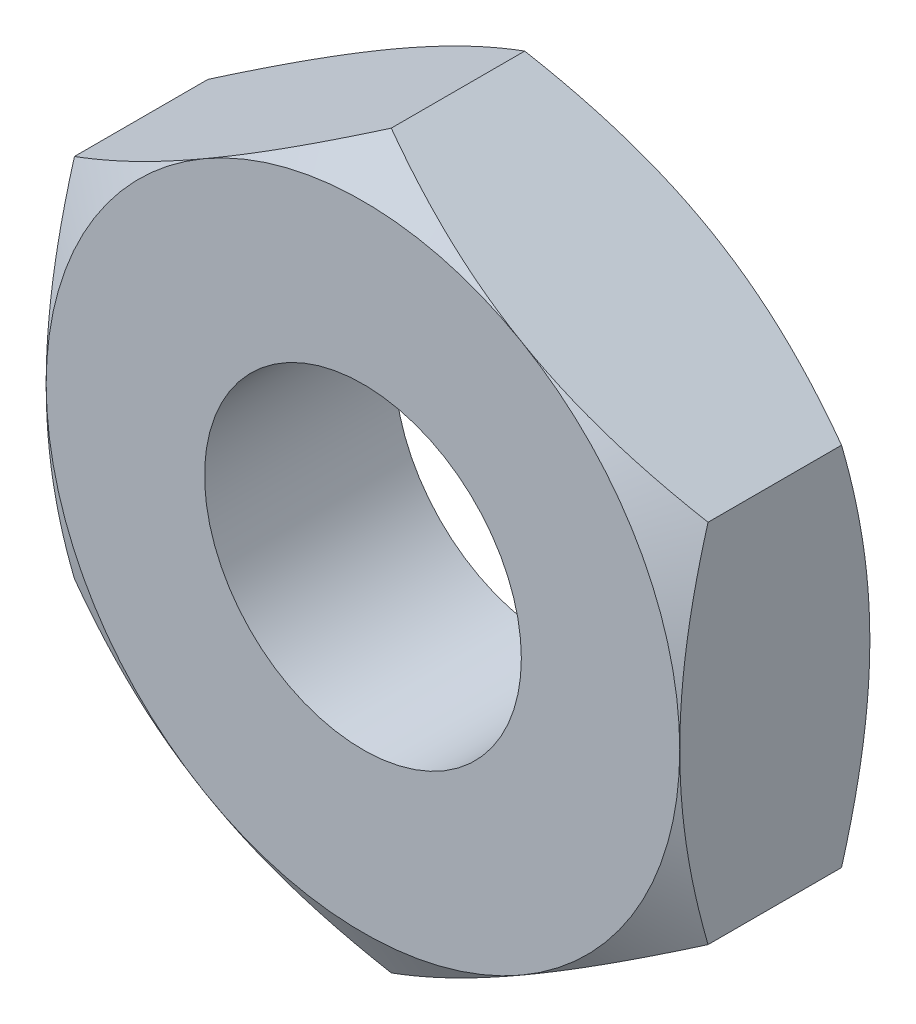
ISO-10303-21;
HEADER;
FILE_DESCRIPTION(('STEP AP214'),'2;1');
FILE_NAME('part.step','',(''),(''),'','','');
FILE_SCHEMA(('AUTOMOTIVE_DESIGN { 1 0 10303 214 1 1 1 1 }'));
ENDSEC;
DATA;
#1=APPLICATION_CONTEXT('core data for automotive mechanical design processes');
#2=APPLICATION_PROTOCOL_DEFINITION('international standard','automotive_design',2000,#1);
#3=PRODUCT_CONTEXT('',#1,'mechanical');
#4=PRODUCT('Part','Part','',(#3));
#5=PRODUCT_RELATED_PRODUCT_CATEGORY('part','',(#4));
#6=PRODUCT_DEFINITION_FORMATION('','',#4);
#7=PRODUCT_DEFINITION_CONTEXT('part definition',#1,'design');
#8=PRODUCT_DEFINITION('design','',#6,#7);
#9=PRODUCT_DEFINITION_SHAPE('','',#8);
#10=(LENGTH_UNIT() NAMED_UNIT(*) SI_UNIT(.MILLI.,.METRE.));
#11=(NAMED_UNIT(*) PLANE_ANGLE_UNIT() SI_UNIT($,.RADIAN.));
#12=(NAMED_UNIT(*) SI_UNIT($,.STERADIAN.) SOLID_ANGLE_UNIT());
#13=UNCERTAINTY_MEASURE_WITH_UNIT(LENGTH_MEASURE(1.E-05),#10,'distance_accuracy_value','');
#14=(GEOMETRIC_REPRESENTATION_CONTEXT(3) GLOBAL_UNCERTAINTY_ASSIGNED_CONTEXT((#13)) GLOBAL_UNIT_ASSIGNED_CONTEXT((#10,
#11,#12)) REPRESENTATION_CONTEXT('',''));
#15=CARTESIAN_POINT('',(0.,0.,0.));
#16=DIRECTION('',(0.,0.,1.));
#17=DIRECTION('',(1.,0.,0.));
#18=AXIS2_PLACEMENT_3D('',#15,#16,#17);
#19=CARTESIAN_POINT('',(0.,0.,-0.6));
#20=DIRECTION('',(0.,0.,1.));
#21=DIRECTION('',(1.,0.,0.));
#22=AXIS2_PLACEMENT_3D('',#19,#20,#21);
#23=PLANE('',#22);
#24=CARTESIAN_POINT('',(0.,0.,-0.6));
#25=DIRECTION('',(0.,0.,1.));
#26=DIRECTION('',(1.,0.,0.));
#27=AXIS2_PLACEMENT_3D('',#24,#25,#26);
#28=CIRCLE('',#27,1.);
#29=CARTESIAN_POINT('',(1.,0.,-0.6));
#30=VERTEX_POINT('',#29);
#31=EDGE_CURVE('E250',#30,#30,#28,.T.);
#32=ORIENTED_EDGE('',*,*,#31,.T.);
#33=EDGE_LOOP('',(#32));
#34=FACE_BOUND('',#33,.T.);
#35=CARTESIAN_POINT('',(0.,0.,-0.6));
#36=DIRECTION('',(0.,0.,1.));
#37=DIRECTION('',(1.,0.,0.));
#38=AXIS2_PLACEMENT_3D('',#35,#36,#37);
#39=CIRCLE('',#38,2.);
#40=CARTESIAN_POINT('',(2.,0.,-0.6));
#41=VERTEX_POINT('',#40);
#42=CARTESIAN_POINT('',(0.999999999999994,1.73205080756888,-0.6));
#43=VERTEX_POINT('',#42);
#44=EDGE_CURVE('E131',#41,#43,#39,.T.);
#45=ORIENTED_EDGE('',*,*,#44,.F.);
#46=CARTESIAN_POINT('',(0.,0.,-0.6));
#47=DIRECTION('',(0.,0.,1.));
#48=DIRECTION('',(1.,0.,0.));
#49=AXIS2_PLACEMENT_3D('',#46,#47,#48);
#50=CIRCLE('',#49,2.);
#51=CARTESIAN_POINT('',(1.00000000000001,-1.73205080756887,-0.6));
#52=VERTEX_POINT('',#51);
#53=EDGE_CURVE('E12',#41,#52,#50,.F.);
#54=ORIENTED_EDGE('',*,*,#53,.T.);
#55=CARTESIAN_POINT('',(-0.999999999999995,-1.73205080756888,-0.6));
#56=VERTEX_POINT('',#55);
#57=EDGE_CURVE('E43',#52,#56,#50,.F.);
#58=ORIENTED_EDGE('',*,*,#57,.T.);
#59=CARTESIAN_POINT('',(-2.,0.,-0.6));
#60=VERTEX_POINT('',#59);
#61=EDGE_CURVE('E309',#56,#60,#50,.F.);
#62=ORIENTED_EDGE('',*,*,#61,.T.);
#63=CARTESIAN_POINT('',(-1.,1.73205080756888,-0.6));
#64=VERTEX_POINT('',#63);
#65=EDGE_CURVE('E143',#60,#64,#50,.F.);
#66=ORIENTED_EDGE('',*,*,#65,.T.);
#67=EDGE_CURVE('E44',#64,#43,#50,.F.);
#68=ORIENTED_EDGE('',*,*,#67,.T.);
#69=EDGE_LOOP('',(#45,#54,#58,#62,#66,#68));
#70=FACE_BOUND('',#69,.T.);
#71=ADVANCED_FACE('F34',(#34,#70),#23,.F.);
#72=CARTESIAN_POINT('',(0.,0.,0.6));
#73=DIRECTION('',(0.,0.,1.));
#74=DIRECTION('',(1.,0.,0.));
#75=AXIS2_PLACEMENT_3D('',#72,#73,#74);
#76=PLANE('',#75);
#77=CARTESIAN_POINT('',(0.,0.,0.6));
#78=DIRECTION('',(0.,0.,1.));
#79=DIRECTION('',(1.,0.,0.));
#80=AXIS2_PLACEMENT_3D('',#77,#78,#79);
#81=CIRCLE('',#80,1.);
#82=CARTESIAN_POINT('',(1.,0.,0.6));
#83=VERTEX_POINT('',#82);
#84=EDGE_CURVE('E246',#83,#83,#81,.T.);
#85=ORIENTED_EDGE('',*,*,#84,.F.);
#86=EDGE_LOOP('',(#85));
#87=FACE_BOUND('',#86,.T.);
#88=CARTESIAN_POINT('',(0.,0.,0.6));
#89=DIRECTION('',(0.,0.,1.));
#90=DIRECTION('',(1.,0.,0.));
#91=AXIS2_PLACEMENT_3D('',#88,#89,#90);
#92=CIRCLE('',#91,2.);
#93=CARTESIAN_POINT('',(1.00000000000001,-1.73205080756887,0.6));
#94=VERTEX_POINT('',#93);
#95=CARTESIAN_POINT('',(2.,0.,0.6));
#96=VERTEX_POINT('',#95);
#97=EDGE_CURVE('E291',#94,#96,#92,.T.);
#98=ORIENTED_EDGE('',*,*,#97,.T.);
#99=CARTESIAN_POINT('',(0.999999999999997,1.73205080756889,0.6));
#100=VERTEX_POINT('',#99);
#101=EDGE_CURVE('E280',#96,#100,#92,.T.);
#102=ORIENTED_EDGE('',*,*,#101,.T.);
#103=CARTESIAN_POINT('',(-1.,1.73205080756888,0.6));
#104=VERTEX_POINT('',#103);
#105=EDGE_CURVE('E284',#100,#104,#92,.T.);
#106=ORIENTED_EDGE('',*,*,#105,.T.);
#107=CARTESIAN_POINT('',(-2.,0.,0.6));
#108=VERTEX_POINT('',#107);
#109=EDGE_CURVE('E288',#104,#108,#92,.T.);
#110=ORIENTED_EDGE('',*,*,#109,.T.);
#111=CARTESIAN_POINT('',(-0.999999999999995,-1.73205080756888,0.6));
#112=VERTEX_POINT('',#111);
#113=EDGE_CURVE('E294',#108,#112,#92,.T.);
#114=ORIENTED_EDGE('',*,*,#113,.T.);
#115=EDGE_CURVE('E293',#112,#94,#92,.T.);
#116=ORIENTED_EDGE('',*,*,#115,.T.);
#117=EDGE_LOOP('',(#98,#102,#106,#110,#114,#116));
#118=FACE_BOUND('',#117,.T.);
#119=ADVANCED_FACE('F289',(#87,#118),#76,.T.);
#120=CARTESIAN_POINT('',(0.,2.3094010767585,0.6));
#121=DIRECTION('',(0.500000000000002,-0.866025403784438,0.));
#122=DIRECTION('',(0.866025403784438,0.500000000000002,0.));
#123=AXIS2_PLACEMENT_3D('',#120,#121,#122);
#124=PLANE('',#123);
#125=DIRECTION('',(0.,0.,-1.));
#126=VECTOR('',#125,1.);
#127=CARTESIAN_POINT('',(0.,2.3094010767585,0.6));
#128=LINE('',#127,#126);
#129=CARTESIAN_POINT('',(0.,2.3094010767585,0.421367205045918));
#130=VERTEX_POINT('',#129);
#131=CARTESIAN_POINT('',(0.,2.3094010767585,-0.421367205045918));
#132=VERTEX_POINT('',#131);
#133=EDGE_CURVE('E249',#130,#132,#128,.T.);
#134=ORIENTED_EDGE('',*,*,#133,.T.);
#135=CARTESIAN_POINT('',(0.000200000000000053,2.30951654681234,-0.421300533379501));
#136=CARTESIAN_POINT('',(-0.08769126290006,2.25877250251758,-0.45061046389932));
#137=CARTESIAN_POINT('',(-0.176341194473591,2.20759044065996,-0.477267148019532));
#138=CARTESIAN_POINT('',(-0.355176246997802,2.10433997494456,-0.523797508979278));
#139=CARTESIAN_POINT('',(-0.445364546505036,2.05226973594631,-0.54365472361722));
#140=CARTESIAN_POINT('',(-0.624623385763306,1.94877459684592,-0.574566535976747));
#141=CARTESIAN_POINT('',(-0.713666338226304,1.89736562427197,-0.585826848401469));
#142=CARTESIAN_POINT('',(-0.892171397785042,1.79430568008402,-0.599271337405358));
#143=CARTESIAN_POINT('',(-0.981632855703957,1.74265508327244,-0.601466645046532));
#144=CARTESIAN_POINT('',(-1.1488083535488,1.64613626458981,-0.596909010669351));
#145=CARTESIAN_POINT('',(-1.22654737026578,1.60125362236172,-0.591275125312986));
#146=CARTESIAN_POINT('',(-1.38151891453613,1.51178075956051,-0.573416104739172));
#147=CARTESIAN_POINT('',(-1.4587509057412,1.46719084864821,-0.561184863976561));
#148=CARTESIAN_POINT('',(-1.6140421864822,1.37753338590959,-0.53060656313239));
#149=CARTESIAN_POINT('',(-1.69208181310738,1.33247718647008,-0.512129832934284));
#150=CARTESIAN_POINT('',(-1.84699686569214,1.24303693915875,-0.470194481787144));
#151=CARTESIAN_POINT('',(-1.92387427762312,1.19865174468579,-0.446745719507687));
#152=CARTESIAN_POINT('',(-2.0002,1.15458506832541,-0.421300533379502));
#153=B_SPLINE_CURVE_WITH_KNOTS('',3,(#135,#136,#137,#138,#139,#140,#141,#142,#143,#144,#145,
#146,#147,#148,#149,#150,#151,#152),.UNSPECIFIED.,.F.,.F.,(4,2,2,2,2,2,2,2,4),(0.,
0.31703182469561,0.634825876346564,0.944753967652636,1.25430138000371,1.52387047293094,
1.79368946861029,2.06949491027634,2.34475850821473),.UNSPECIFIED.);
#154=EDGE_CURVE('E57',#132,#64,#153,.T.);
#155=ORIENTED_EDGE('',*,*,#154,.T.);
#156=CARTESIAN_POINT('',(-2.,1.15470053837925,-0.421367205045919));
#157=VERTEX_POINT('',#156);
#158=EDGE_CURVE('E176',#64,#157,#153,.T.);
#159=ORIENTED_EDGE('',*,*,#158,.T.);
#160=DIRECTION('',(0.,0.,-1.));
#161=VECTOR('',#160,1.);
#162=CARTESIAN_POINT('',(-2.,1.15470053837925,0.6));
#163=LINE('',#162,#161);
#164=CARTESIAN_POINT('',(-2.,1.15470053837925,0.421367205045919));
#165=VERTEX_POINT('',#164);
#166=EDGE_CURVE('E264',#165,#157,#163,.T.);
#167=ORIENTED_EDGE('',*,*,#166,.F.);
#168=CARTESIAN_POINT('',(0.000200000000000053,2.30951654681234,0.421300533379501));
#169=CARTESIAN_POINT('',(-0.08769126290006,2.25877250251758,0.45061046389932));
#170=CARTESIAN_POINT('',(-0.176341194473591,2.20759044065996,0.477267148019532));
#171=CARTESIAN_POINT('',(-0.355176246997802,2.10433997494456,0.523797508979278));
#172=CARTESIAN_POINT('',(-0.445364546505036,2.05226973594631,0.54365472361722));
#173=CARTESIAN_POINT('',(-0.624623385763306,1.94877459684592,0.574566535976747));
#174=CARTESIAN_POINT('',(-0.713666338226304,1.89736562427197,0.585826848401469));
#175=CARTESIAN_POINT('',(-0.892171397785042,1.79430568008402,0.599271337405358));
#176=CARTESIAN_POINT('',(-0.981632855703957,1.74265508327244,0.601466645046532));
#177=CARTESIAN_POINT('',(-1.1488083535488,1.64613626458981,0.596909010669351));
#178=CARTESIAN_POINT('',(-1.22654737026578,1.60125362236172,0.591275125312986));
#179=CARTESIAN_POINT('',(-1.38151891453613,1.51178075956051,0.573416104739172));
#180=CARTESIAN_POINT('',(-1.4587509057412,1.46719084864821,0.561184863976561));
#181=CARTESIAN_POINT('',(-1.6140421864822,1.37753338590959,0.53060656313239));
#182=CARTESIAN_POINT('',(-1.69208181310738,1.33247718647008,0.512129832934284));
#183=CARTESIAN_POINT('',(-1.84699686569214,1.24303693915875,0.470194481787144));
#184=CARTESIAN_POINT('',(-1.92387427762312,1.19865174468579,0.446745719507687));
#185=CARTESIAN_POINT('',(-2.0002,1.15458506832541,0.421300533379502));
#186=B_SPLINE_CURVE_WITH_KNOTS('',3,(#168,#169,#170,#171,#172,#173,#174,#175,#176,#177,#178,
#179,#180,#181,#182,#183,#184,#185),.UNSPECIFIED.,.F.,.F.,(4,2,2,2,2,2,2,2,4),(0.,
0.31703182469561,0.634825876346564,0.944753967652636,1.25430138000371,1.52387047293094,
1.79368946861029,2.06949491027634,2.34475850821473),.UNSPECIFIED.);
#187=EDGE_CURVE('E239',#104,#165,#186,.T.);
#188=ORIENTED_EDGE('',*,*,#187,.F.);
#189=EDGE_CURVE('E245',#130,#104,#186,.T.);
#190=ORIENTED_EDGE('',*,*,#189,.F.);
#191=EDGE_LOOP('',(#134,#155,#159,#167,#188,#190));
#192=FACE_BOUND('',#191,.T.);
#193=ADVANCED_FACE('F36',(#192),#124,.F.);
#194=CARTESIAN_POINT('',(-2.,1.15470053837925,0.6));
#195=DIRECTION('',(1.,0.,0.));
#196=DIRECTION('',(0.,1.,0.));
#197=AXIS2_PLACEMENT_3D('',#194,#195,#196);
#198=PLANE('',#197);
#199=ORIENTED_EDGE('',*,*,#166,.T.);
#200=CARTESIAN_POINT('',(-2.00000000000001,3.75746337783833,0.702840986247626));
#201=CARTESIAN_POINT('',(-2.00000000000001,3.66917172951027,0.657849443135192));
#202=CARTESIAN_POINT('',(-2.00000000000001,3.58074237089131,0.61312562510321));
#203=CARTESIAN_POINT('',(-2.00000000000001,3.40354641738006,0.524346435933649));
#204=CARTESIAN_POINT('',(-2.00000000000001,3.31477981481889,0.480291080111966));
#205=CARTESIAN_POINT('',(-2.00000000000001,3.13669482039065,0.392906957020903));
#206=CARTESIAN_POINT('',(-2.00000000000001,3.04737573181409,0.349579606944415));
#207=CARTESIAN_POINT('',(-2.00000000000001,2.86826224878121,0.263913636120215));
#208=CARTESIAN_POINT('',(-2.00000000000001,2.77846784732515,0.221575029983321));
#209=CARTESIAN_POINT('',(-2.00000000000001,2.59380818983547,0.136035760364889));
#210=CARTESIAN_POINT('',(-2.00000000000001,2.49891380906719,0.0928977818514236));
#211=CARTESIAN_POINT('',(-2.00000000000001,2.30836710346166,0.00833126977036773));
#212=CARTESIAN_POINT('',(-2.00000000000001,2.21271480125747,-0.0330973146155662));
#213=CARTESIAN_POINT('',(-2.00000000000001,2.02055466391046,-0.113736768129769));
#214=CARTESIAN_POINT('',(-2.00000000000001,1.92404748617733,-0.152949194790178));
#215=CARTESIAN_POINT('',(-2.00000000000001,1.7298992750654,-0.228549126978886));
#216=CARTESIAN_POINT('',(-2.00000000000001,1.63225796403676,-0.264935923255911));
#217=CARTESIAN_POINT('',(-2.,1.4171681199187,-0.340515018572487));
#218=CARTESIAN_POINT('',(-2.,1.29944840226887,-0.378947707550387));
#219=CARTESIAN_POINT('',(-2.,1.06193288533875,-0.448655367473114));
#220=CARTESIAN_POINT('',(-2.,0.942138243099315,-0.479934197642316));
#221=CARTESIAN_POINT('',(-2.,0.702605318604806,-0.532456937150817));
#222=CARTESIAN_POINT('',(-2.,0.58290617665427,-0.553874120760022));
#223=CARTESIAN_POINT('',(-2.,0.342017147900515,-0.585190615726701));
#224=CARTESIAN_POINT('',(-2.,0.220828109926115,-0.595096203771341));
#225=CARTESIAN_POINT('',(-2.,-0.0232282060015865,-0.602087718763101));
#226=CARTESIAN_POINT('',(-2.,-0.146099624841999,-0.59903618356641));
#227=CARTESIAN_POINT('',(-2.,-0.390875350621727,-0.580247436672821));
#228=CARTESIAN_POINT('',(-2.,-0.512779232204752,-0.564504927224491));
#229=CARTESIAN_POINT('',(-2.,-0.756985470946914,-0.521929945841561));
#230=CARTESIAN_POINT('',(-2.,-0.87925031587679,-0.49488980160422));
#231=CARTESIAN_POINT('',(-2.,-1.12155171452338,-0.432315261828746));
#232=CARTESIAN_POINT('',(-2.,-1.24158783698637,-0.396779240438377));
#233=CARTESIAN_POINT('',(-2.,-1.46730599994426,-0.323476159369775));
#234=CARTESIAN_POINT('',(-2.,-1.57318984746894,-0.286318837832401));
#235=CARTESIAN_POINT('',(-1.99999999999999,-1.78356953450497,-0.208239316128));
#236=CARTESIAN_POINT('',(-1.99999999999999,-1.88806512681808,-0.167316455470022));
#237=CARTESIAN_POINT('',(-1.99999999999999,-2.09597854894717,-0.0826059301377737));
#238=CARTESIAN_POINT('',(-1.99999999999999,-2.19939543852549,-0.0388159747607385));
#239=CARTESIAN_POINT('',(-1.99999999999999,-2.4052882083347,0.0509255344358591));
#240=CARTESIAN_POINT('',(-1.99999999999999,-2.50776404575429,0.0968771860209141));
#241=CARTESIAN_POINT('',(-1.99999999999999,-2.70670372287223,0.188044843586186));
#242=CARTESIAN_POINT('',(-1.99999999999999,-2.8032059635241,0.233177366355573));
#243=CARTESIAN_POINT('',(-1.99999999999999,-2.99564549642073,0.324635109776746));
#244=CARTESIAN_POINT('',(-1.99999999999999,-3.09158277400964,0.370960361203404));
#245=CARTESIAN_POINT('',(-1.99999999999999,-3.28273456532147,0.464440880452887));
#246=CARTESIAN_POINT('',(-1.99999999999999,-3.3779503234191,0.511593609421466));
#247=CARTESIAN_POINT('',(-1.99999999999999,-3.56798434011714,0.60667601457916));
#248=CARTESIAN_POINT('',(-1.99999999999999,-3.66280262841558,0.654605631370073));
#249=CARTESIAN_POINT('',(-1.99999999999999,-3.75746337783835,0.702840986247627));
#250=B_SPLINE_CURVE_WITH_KNOTS('',3,(#200,#201,#202,#203,#204,#205,#206,#207,#208,#209,#210,
#211,#212,#213,#214,#215,#216,#217,#218,#219,#220,#221,#222,#223,#224,#225,#226,#227,#228,#229,
#230,#231,#232,#233,#234,#235,#236,#237,#238,#239,#240,#241,#242,#243,#244,#245,#246,#247,#248,
#249),.UNSPECIFIED.,.F.,.F.,(4,2,2,2,2,2,2,2,2,2,2,2,2,2,2,2,2,2,2,2,2,2,2,2,4),(0.,
0.29728375049296,0.594574302137346,0.892388736257846,1.19020756844579,1.5029121581207,
1.81560744473584,2.12808016171273,2.44063105950698,2.8119699579421,3.18310805870476,
3.54744973205117,3.91159265508218,4.27960836927934,4.6477777884582,5.02303531559516,
5.39836471316207,5.73491980378193,6.0715340404828,6.40842058120788,6.74532237273558,
7.06491645637614,7.38451879448682,7.70327003101737,8.02199701080364),.UNSPECIFIED.);
#251=EDGE_CURVE('E297',#157,#60,#250,.T.);
#252=ORIENTED_EDGE('',*,*,#251,.T.);
#253=CARTESIAN_POINT('',(-2.,-1.15470053837926,-0.421367205045919));
#254=VERTEX_POINT('',#253);
#255=EDGE_CURVE('E202',#60,#254,#250,.T.);
#256=ORIENTED_EDGE('',*,*,#255,.T.);
#257=DIRECTION('',(0.,0.,-1.));
#258=VECTOR('',#257,1.);
#259=CARTESIAN_POINT('',(-2.,-1.15470053837926,0.6));
#260=LINE('',#259,#258);
#261=CARTESIAN_POINT('',(-2.,-1.15470053837926,0.421367205045919));
#262=VERTEX_POINT('',#261);
#263=EDGE_CURVE('E261',#262,#254,#260,.T.);
#264=ORIENTED_EDGE('',*,*,#263,.F.);
#265=CARTESIAN_POINT('',(-2.00000000000001,3.75746337783833,-0.702840986247626));
#266=CARTESIAN_POINT('',(-2.00000000000001,3.66917172951027,-0.657849443135192));
#267=CARTESIAN_POINT('',(-2.00000000000001,3.58074237089131,-0.61312562510321));
#268=CARTESIAN_POINT('',(-2.00000000000001,3.40354641738006,-0.524346435933649));
#269=CARTESIAN_POINT('',(-2.00000000000001,3.31477981481889,-0.480291080111966));
#270=CARTESIAN_POINT('',(-2.00000000000001,3.13669482039065,-0.392906957020903));
#271=CARTESIAN_POINT('',(-2.00000000000001,3.04737573181409,-0.349579606944415));
#272=CARTESIAN_POINT('',(-2.00000000000001,2.86826224878121,-0.263913636120215));
#273=CARTESIAN_POINT('',(-2.00000000000001,2.77846784732515,-0.221575029983321));
#274=CARTESIAN_POINT('',(-2.00000000000001,2.59380818983547,-0.136035760364889));
#275=CARTESIAN_POINT('',(-2.00000000000001,2.49891380906719,-0.0928977818514236));
#276=CARTESIAN_POINT('',(-2.00000000000001,2.30836710346166,-0.00833126977036773));
#277=CARTESIAN_POINT('',(-2.00000000000001,2.21271480125747,0.0330973146155662));
#278=CARTESIAN_POINT('',(-2.00000000000001,2.02055466391046,0.113736768129769));
#279=CARTESIAN_POINT('',(-2.00000000000001,1.92404748617733,0.152949194790178));
#280=CARTESIAN_POINT('',(-2.00000000000001,1.7298992750654,0.228549126978886));
#281=CARTESIAN_POINT('',(-2.00000000000001,1.63225796403676,0.264935923255911));
#282=CARTESIAN_POINT('',(-2.,1.4171681199187,0.340515018572487));
#283=CARTESIAN_POINT('',(-2.,1.29944840226887,0.378947707550387));
#284=CARTESIAN_POINT('',(-2.,1.06193288533875,0.448655367473114));
#285=CARTESIAN_POINT('',(-2.,0.942138243099315,0.479934197642316));
#286=CARTESIAN_POINT('',(-2.,0.702605318604806,0.532456937150817));
#287=CARTESIAN_POINT('',(-2.,0.58290617665427,0.553874120760022));
#288=CARTESIAN_POINT('',(-2.,0.342017147900515,0.585190615726701));
#289=CARTESIAN_POINT('',(-2.,0.220828109926115,0.595096203771341));
#290=CARTESIAN_POINT('',(-2.,-0.0232282060015865,0.602087718763101));
#291=CARTESIAN_POINT('',(-2.,-0.146099624841999,0.59903618356641));
#292=CARTESIAN_POINT('',(-2.,-0.390875350621727,0.580247436672821));
#293=CARTESIAN_POINT('',(-2.,-0.512779232204752,0.564504927224491));
#294=CARTESIAN_POINT('',(-2.,-0.756985470946914,0.521929945841561));
#295=CARTESIAN_POINT('',(-2.,-0.87925031587679,0.49488980160422));
#296=CARTESIAN_POINT('',(-2.,-1.12155171452338,0.432315261828746));
#297=CARTESIAN_POINT('',(-2.,-1.24158783698637,0.396779240438377));
#298=CARTESIAN_POINT('',(-2.,-1.46730599994426,0.323476159369775));
#299=CARTESIAN_POINT('',(-2.,-1.57318984746894,0.286318837832401));
#300=CARTESIAN_POINT('',(-1.99999999999999,-1.78356953450497,0.208239316128));
#301=CARTESIAN_POINT('',(-1.99999999999999,-1.88806512681808,0.167316455470022));
#302=CARTESIAN_POINT('',(-1.99999999999999,-2.09597854894717,0.0826059301377737));
#303=CARTESIAN_POINT('',(-1.99999999999999,-2.19939543852549,0.0388159747607385));
#304=CARTESIAN_POINT('',(-1.99999999999999,-2.4052882083347,-0.0509255344358591));
#305=CARTESIAN_POINT('',(-1.99999999999999,-2.50776404575429,-0.0968771860209141));
#306=CARTESIAN_POINT('',(-1.99999999999999,-2.70670372287223,-0.188044843586186));
#307=CARTESIAN_POINT('',(-1.99999999999999,-2.8032059635241,-0.233177366355573));
#308=CARTESIAN_POINT('',(-1.99999999999999,-2.99564549642073,-0.324635109776746));
#309=CARTESIAN_POINT('',(-1.99999999999999,-3.09158277400964,-0.370960361203404));
#310=CARTESIAN_POINT('',(-1.99999999999999,-3.28273456532147,-0.464440880452887));
#311=CARTESIAN_POINT('',(-1.99999999999999,-3.3779503234191,-0.511593609421466));
#312=CARTESIAN_POINT('',(-1.99999999999999,-3.56798434011714,-0.60667601457916));
#313=CARTESIAN_POINT('',(-1.99999999999999,-3.66280262841558,-0.654605631370073));
#314=CARTESIAN_POINT('',(-1.99999999999999,-3.75746337783835,-0.702840986247627));
#315=B_SPLINE_CURVE_WITH_KNOTS('',3,(#265,#266,#267,#268,#269,#270,#271,#272,#273,#274,#275,
#276,#277,#278,#279,#280,#281,#282,#283,#284,#285,#286,#287,#288,#289,#290,#291,#292,#293,#294,
#295,#296,#297,#298,#299,#300,#301,#302,#303,#304,#305,#306,#307,#308,#309,#310,#311,#312,#313,
#314),.UNSPECIFIED.,.F.,.F.,(4,2,2,2,2,2,2,2,2,2,2,2,2,2,2,2,2,2,2,2,2,2,2,2,4),(0.,
0.29728375049296,0.594574302137346,0.892388736257846,1.19020756844579,1.5029121581207,
1.81560744473584,2.12808016171273,2.44063105950698,2.8119699579421,3.18310805870476,
3.54744973205117,3.91159265508218,4.27960836927934,4.6477777884582,5.02303531559516,
5.39836471316207,5.73491980378193,6.0715340404828,6.40842058120788,6.74532237273558,
7.06491645637614,7.38451879448682,7.70327003101737,8.02199701080364),.UNSPECIFIED.);
#316=EDGE_CURVE('E232',#108,#262,#315,.T.);
#317=ORIENTED_EDGE('',*,*,#316,.F.);
#318=EDGE_CURVE('E238',#165,#108,#315,.T.);
#319=ORIENTED_EDGE('',*,*,#318,.F.);
#320=EDGE_LOOP('',(#199,#252,#256,#264,#317,#319));
#321=FACE_BOUND('',#320,.T.);
#322=ADVANCED_FACE('F211',(#321),#198,.F.);
#323=CARTESIAN_POINT('',(-2.,-1.15470053837926,0.6));
#324=DIRECTION('',(0.499999999999997,0.86602540378444,0.));
#325=DIRECTION('',(-0.86602540378444,0.499999999999997,0.));
#326=AXIS2_PLACEMENT_3D('',#323,#324,#325);
#327=PLANE('',#326);
#328=ORIENTED_EDGE('',*,*,#263,.T.);
#329=CARTESIAN_POINT('',(-2.0002,-1.15458506832542,-0.421300533379502));
#330=CARTESIAN_POINT('',(-1.91230873709994,-1.20532911262019,-0.450610463899321));
#331=CARTESIAN_POINT('',(-1.82365880552641,-1.25651117447781,-0.477267148019533));
#332=CARTESIAN_POINT('',(-1.64482375300219,-1.3597616401932,-0.523797508979278));
#333=CARTESIAN_POINT('',(-1.55463545349496,-1.41183187919146,-0.54365472361722));
#334=CARTESIAN_POINT('',(-1.37537661423669,-1.51532701829184,-0.574566535976747));
#335=CARTESIAN_POINT('',(-1.28633366177369,-1.56673599086579,-0.585826848401468));
#336=CARTESIAN_POINT('',(-1.10782860221495,-1.66979593505374,-0.599271337405358));
#337=CARTESIAN_POINT('',(-1.01836714429604,-1.72144653186532,-0.601466645046531));
#338=CARTESIAN_POINT('',(-0.851191646451197,-1.81796535054794,-0.596909010669351));
#339=CARTESIAN_POINT('',(-0.773452629734211,-1.86284799277603,-0.591275125312985));
#340=CARTESIAN_POINT('',(-0.618481085463861,-1.95232085557725,-0.573416104739171));
#341=CARTESIAN_POINT('',(-0.541249094258796,-1.99691076648955,-0.56118486397656));
#342=CARTESIAN_POINT('',(-0.385957813517794,-2.08656822922816,-0.53060656313239));
#343=CARTESIAN_POINT('',(-0.307918186892615,-2.13162442866767,-0.512129832934284));
#344=CARTESIAN_POINT('',(-0.153003134307859,-2.221064675979,-0.470194481787144));
#345=CARTESIAN_POINT('',(-0.0761257223768739,-2.26544987045196,-0.446745719507687));
#346=CARTESIAN_POINT('',(0.000200000000006037,-2.30951654681234,-0.421300533379502));
#347=B_SPLINE_CURVE_WITH_KNOTS('',3,(#329,#330,#331,#332,#333,#334,#335,#336,#337,#338,#339,
#340,#341,#342,#343,#344,#345,#346),.UNSPECIFIED.,.F.,.F.,(4,2,2,2,2,2,2,2,4),(0.,
0.31703182469561,0.634825876346563,0.944753967652636,1.25430138000371,1.52387047293094,
1.79368946861028,2.06949491027634,2.34475850821472),.UNSPECIFIED.);
#348=EDGE_CURVE('E200',#254,#56,#347,.T.);
#349=ORIENTED_EDGE('',*,*,#348,.T.);
#350=CARTESIAN_POINT('',(0.,-2.3094010767585,-0.421367205045919));
#351=VERTEX_POINT('',#350);
#352=EDGE_CURVE('E193',#56,#351,#347,.T.);
#353=ORIENTED_EDGE('',*,*,#352,.T.);
#354=DIRECTION('',(0.,0.,-1.));
#355=VECTOR('',#354,1.);
#356=CARTESIAN_POINT('',(0.,-2.3094010767585,0.6));
#357=LINE('',#356,#355);
#358=CARTESIAN_POINT('',(0.,-2.3094010767585,0.421367205045919));
#359=VERTEX_POINT('',#358);
#360=EDGE_CURVE('E258',#359,#351,#357,.T.);
#361=ORIENTED_EDGE('',*,*,#360,.F.);
#362=CARTESIAN_POINT('',(-2.0002,-1.15458506832542,0.421300533379502));
#363=CARTESIAN_POINT('',(-1.91230873709994,-1.20532911262019,0.450610463899321));
#364=CARTESIAN_POINT('',(-1.82365880552641,-1.25651117447781,0.477267148019533));
#365=CARTESIAN_POINT('',(-1.64482375300219,-1.3597616401932,0.523797508979278));
#366=CARTESIAN_POINT('',(-1.55463545349496,-1.41183187919146,0.54365472361722));
#367=CARTESIAN_POINT('',(-1.37537661423669,-1.51532701829184,0.574566535976747));
#368=CARTESIAN_POINT('',(-1.28633366177369,-1.56673599086579,0.585826848401468));
#369=CARTESIAN_POINT('',(-1.10782860221495,-1.66979593505374,0.599271337405358));
#370=CARTESIAN_POINT('',(-1.01836714429604,-1.72144653186532,0.601466645046531));
#371=CARTESIAN_POINT('',(-0.851191646451197,-1.81796535054794,0.596909010669351));
#372=CARTESIAN_POINT('',(-0.773452629734211,-1.86284799277603,0.591275125312985));
#373=CARTESIAN_POINT('',(-0.618481085463861,-1.95232085557725,0.573416104739171));
#374=CARTESIAN_POINT('',(-0.541249094258796,-1.99691076648955,0.56118486397656));
#375=CARTESIAN_POINT('',(-0.385957813517794,-2.08656822922816,0.53060656313239));
#376=CARTESIAN_POINT('',(-0.307918186892615,-2.13162442866767,0.512129832934284));
#377=CARTESIAN_POINT('',(-0.153003134307859,-2.221064675979,0.470194481787144));
#378=CARTESIAN_POINT('',(-0.0761257223768739,-2.26544987045196,0.446745719507687));
#379=CARTESIAN_POINT('',(0.000200000000006037,-2.30951654681234,0.421300533379502));
#380=B_SPLINE_CURVE_WITH_KNOTS('',3,(#362,#363,#364,#365,#366,#367,#368,#369,#370,#371,#372,
#373,#374,#375,#376,#377,#378,#379),.UNSPECIFIED.,.F.,.F.,(4,2,2,2,2,2,2,2,4),(0.,
0.31703182469561,0.634825876346563,0.944753967652636,1.25430138000371,1.52387047293094,
1.79368946861028,2.06949491027634,2.34475850821472),.UNSPECIFIED.);
#381=EDGE_CURVE('E217',#112,#359,#380,.T.);
#382=ORIENTED_EDGE('',*,*,#381,.F.);
#383=EDGE_CURVE('E224',#262,#112,#380,.T.);
#384=ORIENTED_EDGE('',*,*,#383,.F.);
#385=EDGE_LOOP('',(#328,#349,#353,#361,#382,#384));
#386=FACE_BOUND('',#385,.T.);
#387=ADVANCED_FACE('F207',(#386),#327,.F.);
#388=CARTESIAN_POINT('',(0.,-2.3094010767585,0.6));
#389=DIRECTION('',(-0.500000000000003,0.866025403784437,0.));
#390=DIRECTION('',(-0.866025403784437,-0.500000000000003,0.));
#391=AXIS2_PLACEMENT_3D('',#388,#389,#390);
#392=PLANE('',#391);
#393=ORIENTED_EDGE('',*,*,#360,.T.);
#394=CARTESIAN_POINT('',(-0.000199999999993963,-2.30951654681234,-0.421300533379502));
#395=CARTESIAN_POINT('',(0.0876912629000657,-2.25877250251758,-0.450610463899321));
#396=CARTESIAN_POINT('',(0.176341194473597,-2.20759044065995,-0.477267148019533));
#397=CARTESIAN_POINT('',(0.355176246997807,-2.10433997494456,-0.523797508979279));
#398=CARTESIAN_POINT('',(0.445364546505042,-2.0522697359463,-0.543654723617221));
#399=CARTESIAN_POINT('',(0.624623385763311,-1.94877459684592,-0.574566535976747));
#400=CARTESIAN_POINT('',(0.713666338226308,-1.89736562427197,-0.585826848401469));
#401=CARTESIAN_POINT('',(0.892171397785047,-1.79430568008402,-0.599271337405358));
#402=CARTESIAN_POINT('',(0.981632855703962,-1.74265508327244,-0.601466645046532));
#403=CARTESIAN_POINT('',(1.1488083535488,-1.64613626458981,-0.596909010669351));
#404=CARTESIAN_POINT('',(1.22654737026579,-1.60125362236172,-0.591275125312986));
#405=CARTESIAN_POINT('',(1.38151891453614,-1.5117807595605,-0.573416104739172));
#406=CARTESIAN_POINT('',(1.4587509057412,-1.46719084864821,-0.561184863976561));
#407=CARTESIAN_POINT('',(1.6140421864822,-1.37753338590959,-0.53060656313239));
#408=CARTESIAN_POINT('',(1.69208181310738,-1.33247718647008,-0.512129832934284));
#409=CARTESIAN_POINT('',(1.84699686569214,-1.24303693915875,-0.470194481787144));
#410=CARTESIAN_POINT('',(1.92387427762312,-1.19865174468579,-0.446745719507687));
#411=CARTESIAN_POINT('',(2.0002,-1.15458506832541,-0.421300533379502));
#412=B_SPLINE_CURVE_WITH_KNOTS('',3,(#394,#395,#396,#397,#398,#399,#400,#401,#402,#403,#404,
#405,#406,#407,#408,#409,#410,#411),.UNSPECIFIED.,.F.,.F.,(4,2,2,2,2,2,2,2,4),(0.,
0.31703182469561,0.634825876346563,0.944753967652635,1.25430138000371,1.52387047293094,
1.79368946861028,2.06949491027634,2.34475850821473),.UNSPECIFIED.);
#413=EDGE_CURVE('E201',#351,#52,#412,.T.);
#414=ORIENTED_EDGE('',*,*,#413,.T.);
#415=CARTESIAN_POINT('',(2.,-1.15470053837924,-0.421367205045919));
#416=VERTEX_POINT('',#415);
#417=EDGE_CURVE('E186',#52,#416,#412,.T.);
#418=ORIENTED_EDGE('',*,*,#417,.T.);
#419=DIRECTION('',(0.,0.,-1.));
#420=VECTOR('',#419,1.);
#421=CARTESIAN_POINT('',(2.,-1.15470053837924,0.6));
#422=LINE('',#421,#420);
#423=CARTESIAN_POINT('',(2.,-1.15470053837924,0.421367205045919));
#424=VERTEX_POINT('',#423);
#425=EDGE_CURVE('E255',#424,#416,#422,.T.);
#426=ORIENTED_EDGE('',*,*,#425,.F.);
#427=CARTESIAN_POINT('',(-0.000199999999993963,-2.30951654681234,0.421300533379502));
#428=CARTESIAN_POINT('',(0.0876912629000657,-2.25877250251758,0.450610463899321));
#429=CARTESIAN_POINT('',(0.176341194473597,-2.20759044065995,0.477267148019533));
#430=CARTESIAN_POINT('',(0.355176246997807,-2.10433997494456,0.523797508979279));
#431=CARTESIAN_POINT('',(0.445364546505042,-2.0522697359463,0.543654723617221));
#432=CARTESIAN_POINT('',(0.624623385763311,-1.94877459684592,0.574566535976747));
#433=CARTESIAN_POINT('',(0.713666338226308,-1.89736562427197,0.585826848401469));
#434=CARTESIAN_POINT('',(0.892171397785047,-1.79430568008402,0.599271337405358));
#435=CARTESIAN_POINT('',(0.981632855703962,-1.74265508327244,0.601466645046532));
#436=CARTESIAN_POINT('',(1.1488083535488,-1.64613626458981,0.596909010669351));
#437=CARTESIAN_POINT('',(1.22654737026579,-1.60125362236172,0.591275125312986));
#438=CARTESIAN_POINT('',(1.38151891453614,-1.5117807595605,0.573416104739172));
#439=CARTESIAN_POINT('',(1.4587509057412,-1.46719084864821,0.561184863976561));
#440=CARTESIAN_POINT('',(1.6140421864822,-1.37753338590959,0.53060656313239));
#441=CARTESIAN_POINT('',(1.69208181310738,-1.33247718647008,0.512129832934284));
#442=CARTESIAN_POINT('',(1.84699686569214,-1.24303693915875,0.470194481787144));
#443=CARTESIAN_POINT('',(1.92387427762312,-1.19865174468579,0.446745719507687));
#444=CARTESIAN_POINT('',(2.0002,-1.15458506832541,0.421300533379502));
#445=B_SPLINE_CURVE_WITH_KNOTS('',3,(#427,#428,#429,#430,#431,#432,#433,#434,#435,#436,#437,
#438,#439,#440,#441,#442,#443,#444),.UNSPECIFIED.,.F.,.F.,(4,2,2,2,2,2,2,2,4),(0.,
0.31703182469561,0.634825876346563,0.944753967652635,1.25430138000371,1.52387047293094,
1.79368946861028,2.06949491027634,2.34475850821473),.UNSPECIFIED.);
#446=EDGE_CURVE('E226',#94,#424,#445,.T.);
#447=ORIENTED_EDGE('',*,*,#446,.F.);
#448=EDGE_CURVE('E225',#359,#94,#445,.T.);
#449=ORIENTED_EDGE('',*,*,#448,.F.);
#450=EDGE_LOOP('',(#393,#414,#418,#426,#447,#449));
#451=FACE_BOUND('',#450,.T.);
#452=ADVANCED_FACE('F210',(#451),#392,.F.);
#453=CARTESIAN_POINT('',(2.,-1.15470053837924,0.6));
#454=DIRECTION('',(-1.,0.,0.));
#455=DIRECTION('',(0.,-1.,0.));
#456=AXIS2_PLACEMENT_3D('',#453,#454,#455);
#457=PLANE('',#456);
#458=ORIENTED_EDGE('',*,*,#425,.T.);
#459=CARTESIAN_POINT('',(2.00000000000001,-3.75746337783833,0.702840986247627));
#460=CARTESIAN_POINT('',(2.00000000000001,-3.66917172951027,0.657849443135193));
#461=CARTESIAN_POINT('',(2.00000000000001,-3.58074237089131,0.613125625103212));
#462=CARTESIAN_POINT('',(2.00000000000001,-3.40354641738007,0.52434643593365));
#463=CARTESIAN_POINT('',(2.00000000000001,-3.3147798148189,0.480291080111967));
#464=CARTESIAN_POINT('',(2.00000000000001,-3.13669482039065,0.392906957020904));
#465=CARTESIAN_POINT('',(2.00000000000001,-3.04737573181409,0.349579606944416));
#466=CARTESIAN_POINT('',(2.00000000000001,-2.86826224878122,0.263913636120216));
#467=CARTESIAN_POINT('',(2.00000000000001,-2.77846784732516,0.221575029983322));
#468=CARTESIAN_POINT('',(2.00000000000001,-2.59380818983547,0.13603576036489));
#469=CARTESIAN_POINT('',(2.00000000000001,-2.4989138090672,0.0928977818514244));
#470=CARTESIAN_POINT('',(2.00000000000001,-2.30836710346167,0.00833126977036852));
#471=CARTESIAN_POINT('',(2.00000000000001,-2.21271480125748,-0.0330973146155652));
#472=CARTESIAN_POINT('',(2.00000000000001,-2.02055466391047,-0.113736768129768));
#473=CARTESIAN_POINT('',(2.00000000000001,-1.92404748617734,-0.152949194790177));
#474=CARTESIAN_POINT('',(2.00000000000001,-1.7298992750654,-0.228549126978885));
#475=CARTESIAN_POINT('',(2.00000000000001,-1.63225796403677,-0.264935923255911));
#476=CARTESIAN_POINT('',(2.,-1.4171681199187,-0.340515018572487));
#477=CARTESIAN_POINT('',(2.,-1.29944840226887,-0.378947707550387));
#478=CARTESIAN_POINT('',(2.,-1.06193288533875,-0.448655367473114));
#479=CARTESIAN_POINT('',(2.,-0.942138243099316,-0.479934197642316));
#480=CARTESIAN_POINT('',(2.,-0.702605318604807,-0.532456937150817));
#481=CARTESIAN_POINT('',(2.,-0.582906176654272,-0.553874120760022));
#482=CARTESIAN_POINT('',(2.,-0.342017147900516,-0.585190615726701));
#483=CARTESIAN_POINT('',(2.,-0.220828109926117,-0.595096203771341));
#484=CARTESIAN_POINT('',(2.,0.0232282060015849,-0.602087718763101));
#485=CARTESIAN_POINT('',(2.,0.146099624841998,-0.59903618356641));
#486=CARTESIAN_POINT('',(2.,0.390875350621726,-0.580247436672822));
#487=CARTESIAN_POINT('',(2.,0.512779232204751,-0.564504927224491));
#488=CARTESIAN_POINT('',(2.,0.756985470946911,-0.521929945841561));
#489=CARTESIAN_POINT('',(2.,0.879250315876787,-0.49488980160422));
#490=CARTESIAN_POINT('',(2.,1.12155171452338,-0.432315261828747));
#491=CARTESIAN_POINT('',(2.,1.24158783698637,-0.396779240438378));
#492=CARTESIAN_POINT('',(2.,1.46730599994426,-0.323476159369775));
#493=CARTESIAN_POINT('',(2.,1.57318984746894,-0.286318837832402));
#494=CARTESIAN_POINT('',(1.99999999999999,1.78356953450497,-0.208239316128));
#495=CARTESIAN_POINT('',(1.99999999999999,1.88806512681808,-0.167316455470021));
#496=CARTESIAN_POINT('',(1.99999999999999,2.09597854894718,-0.0826059301377723));
#497=CARTESIAN_POINT('',(1.99999999999999,2.1993954385255,-0.0388159747607372));
#498=CARTESIAN_POINT('',(1.99999999999999,2.4052882083347,0.0509255344358609));
#499=CARTESIAN_POINT('',(1.99999999999999,2.5077640457543,0.0968771860209164));
#500=CARTESIAN_POINT('',(1.99999999999999,2.70670372287224,0.188044843586189));
#501=CARTESIAN_POINT('',(1.99999999999999,2.80320596352411,0.233177366355576));
#502=CARTESIAN_POINT('',(1.99999999999999,2.99564549642074,0.324635109776749));
#503=CARTESIAN_POINT('',(1.99999999999999,3.09158277400965,0.370960361203408));
#504=CARTESIAN_POINT('',(1.99999999999999,3.28273456532147,0.46444088045289));
#505=CARTESIAN_POINT('',(1.99999999999999,3.3779503234191,0.511593609421469));
#506=CARTESIAN_POINT('',(1.99999999999999,3.56798434011715,0.606676014579163));
#507=CARTESIAN_POINT('',(1.99999999999999,3.66280262841559,0.654605631370077));
#508=CARTESIAN_POINT('',(1.99999999999999,3.75746337783835,0.702840986247631));
#509=B_SPLINE_CURVE_WITH_KNOTS('',3,(#459,#460,#461,#462,#463,#464,#465,#466,#467,#468,#469,
#470,#471,#472,#473,#474,#475,#476,#477,#478,#479,#480,#481,#482,#483,#484,#485,#486,#487,#488,
#489,#490,#491,#492,#493,#494,#495,#496,#497,#498,#499,#500,#501,#502,#503,#504,#505,#506,#507,
#508),.UNSPECIFIED.,.F.,.F.,(4,2,2,2,2,2,2,2,2,2,2,2,2,2,2,2,2,2,2,2,2,2,2,2,4),(0.,
0.29728375049296,0.594574302137345,0.892388736257846,1.19020756844579,1.5029121581207,
1.81560744473584,2.12808016171273,2.44063105950698,2.8119699579421,3.18310805870476,
3.54744973205117,3.91159265508218,4.27960836927934,4.6477777884582,5.02303531559516,
5.39836471316207,5.73491980378193,6.0715340404828,6.40842058120788,6.74532237273558,
7.06491645637615,7.38451879448683,7.70327003101738,8.02199701080365),.UNSPECIFIED.);
#510=EDGE_CURVE('E150',#416,#41,#509,.T.);
#511=ORIENTED_EDGE('',*,*,#510,.T.);
#512=CARTESIAN_POINT('',(2.,1.15470053837926,-0.421367205045917));
#513=VERTEX_POINT('',#512);
#514=EDGE_CURVE('E137',#41,#513,#509,.T.);
#515=ORIENTED_EDGE('',*,*,#514,.T.);
#516=DIRECTION('',(0.,0.,-1.));
#517=VECTOR('',#516,1.);
#518=CARTESIAN_POINT('',(2.,1.15470053837926,0.6));
#519=LINE('',#518,#517);
#520=CARTESIAN_POINT('',(2.,1.15470053837926,0.421367205045917));
#521=VERTEX_POINT('',#520);
#522=EDGE_CURVE('E149',#521,#513,#519,.T.);
#523=ORIENTED_EDGE('',*,*,#522,.F.);
#524=CARTESIAN_POINT('',(2.00000000000001,-3.75746337783833,-0.702840986247627));
#525=CARTESIAN_POINT('',(2.00000000000001,-3.66917172951027,-0.657849443135193));
#526=CARTESIAN_POINT('',(2.00000000000001,-3.58074237089131,-0.613125625103212));
#527=CARTESIAN_POINT('',(2.00000000000001,-3.40354641738007,-0.52434643593365));
#528=CARTESIAN_POINT('',(2.00000000000001,-3.3147798148189,-0.480291080111967));
#529=CARTESIAN_POINT('',(2.00000000000001,-3.13669482039065,-0.392906957020904));
#530=CARTESIAN_POINT('',(2.00000000000001,-3.04737573181409,-0.349579606944416));
#531=CARTESIAN_POINT('',(2.00000000000001,-2.86826224878122,-0.263913636120216));
#532=CARTESIAN_POINT('',(2.00000000000001,-2.77846784732516,-0.221575029983322));
#533=CARTESIAN_POINT('',(2.00000000000001,-2.59380818983547,-0.13603576036489));
#534=CARTESIAN_POINT('',(2.00000000000001,-2.4989138090672,-0.0928977818514244));
#535=CARTESIAN_POINT('',(2.00000000000001,-2.30836710346167,-0.00833126977036852));
#536=CARTESIAN_POINT('',(2.00000000000001,-2.21271480125748,0.0330973146155652));
#537=CARTESIAN_POINT('',(2.00000000000001,-2.02055466391047,0.113736768129768));
#538=CARTESIAN_POINT('',(2.00000000000001,-1.92404748617734,0.152949194790177));
#539=CARTESIAN_POINT('',(2.00000000000001,-1.7298992750654,0.228549126978885));
#540=CARTESIAN_POINT('',(2.00000000000001,-1.63225796403677,0.264935923255911));
#541=CARTESIAN_POINT('',(2.,-1.4171681199187,0.340515018572487));
#542=CARTESIAN_POINT('',(2.,-1.29944840226887,0.378947707550387));
#543=CARTESIAN_POINT('',(2.,-1.06193288533875,0.448655367473114));
#544=CARTESIAN_POINT('',(2.,-0.942138243099316,0.479934197642316));
#545=CARTESIAN_POINT('',(2.,-0.702605318604807,0.532456937150817));
#546=CARTESIAN_POINT('',(2.,-0.582906176654272,0.553874120760022));
#547=CARTESIAN_POINT('',(2.,-0.342017147900516,0.585190615726701));
#548=CARTESIAN_POINT('',(2.,-0.220828109926117,0.595096203771341));
#549=CARTESIAN_POINT('',(2.,0.0232282060015849,0.602087718763101));
#550=CARTESIAN_POINT('',(2.,0.146099624841998,0.59903618356641));
#551=CARTESIAN_POINT('',(2.,0.390875350621726,0.580247436672822));
#552=CARTESIAN_POINT('',(2.,0.512779232204751,0.564504927224491));
#553=CARTESIAN_POINT('',(2.,0.756985470946911,0.521929945841561));
#554=CARTESIAN_POINT('',(2.,0.879250315876787,0.49488980160422));
#555=CARTESIAN_POINT('',(2.,1.12155171452338,0.432315261828747));
#556=CARTESIAN_POINT('',(2.,1.24158783698637,0.396779240438378));
#557=CARTESIAN_POINT('',(2.,1.46730599994426,0.323476159369775));
#558=CARTESIAN_POINT('',(2.,1.57318984746894,0.286318837832402));
#559=CARTESIAN_POINT('',(1.99999999999999,1.78356953450497,0.208239316128));
#560=CARTESIAN_POINT('',(1.99999999999999,1.88806512681808,0.167316455470021));
#561=CARTESIAN_POINT('',(1.99999999999999,2.09597854894718,0.0826059301377723));
#562=CARTESIAN_POINT('',(1.99999999999999,2.1993954385255,0.0388159747607372));
#563=CARTESIAN_POINT('',(1.99999999999999,2.4052882083347,-0.0509255344358609));
#564=CARTESIAN_POINT('',(1.99999999999999,2.5077640457543,-0.0968771860209164));
#565=CARTESIAN_POINT('',(1.99999999999999,2.70670372287224,-0.188044843586189));
#566=CARTESIAN_POINT('',(1.99999999999999,2.80320596352411,-0.233177366355576));
#567=CARTESIAN_POINT('',(1.99999999999999,2.99564549642074,-0.324635109776749));
#568=CARTESIAN_POINT('',(1.99999999999999,3.09158277400965,-0.370960361203408));
#569=CARTESIAN_POINT('',(1.99999999999999,3.28273456532147,-0.46444088045289));
#570=CARTESIAN_POINT('',(1.99999999999999,3.3779503234191,-0.511593609421469));
#571=CARTESIAN_POINT('',(1.99999999999999,3.56798434011715,-0.606676014579163));
#572=CARTESIAN_POINT('',(1.99999999999999,3.66280262841559,-0.654605631370077));
#573=CARTESIAN_POINT('',(1.99999999999999,3.75746337783835,-0.702840986247631));
#574=B_SPLINE_CURVE_WITH_KNOTS('',3,(#524,#525,#526,#527,#528,#529,#530,#531,#532,#533,#534,
#535,#536,#537,#538,#539,#540,#541,#542,#543,#544,#545,#546,#547,#548,#549,#550,#551,#552,#553,
#554,#555,#556,#557,#558,#559,#560,#561,#562,#563,#564,#565,#566,#567,#568,#569,#570,#571,#572,
#573),.UNSPECIFIED.,.F.,.F.,(4,2,2,2,2,2,2,2,2,2,2,2,2,2,2,2,2,2,2,2,2,2,2,2,4),(0.,
0.29728375049296,0.594574302137345,0.892388736257846,1.19020756844579,1.5029121581207,
1.81560744473584,2.12808016171273,2.44063105950698,2.8119699579421,3.18310805870476,
3.54744973205117,3.91159265508218,4.27960836927934,4.6477777884582,5.02303531559516,
5.39836471316207,5.73491980378193,6.0715340404828,6.40842058120788,6.74532237273558,
7.06491645637615,7.38451879448683,7.70327003101738,8.02199701080365),.UNSPECIFIED.);
#575=EDGE_CURVE('E282',#96,#521,#574,.T.);
#576=ORIENTED_EDGE('',*,*,#575,.F.);
#577=EDGE_CURVE('E292',#424,#96,#574,.T.);
#578=ORIENTED_EDGE('',*,*,#577,.F.);
#579=EDGE_LOOP('',(#458,#511,#515,#523,#576,#578));
#580=FACE_BOUND('',#579,.T.);
#581=ADVANCED_FACE('F319',(#580),#457,.F.);
#582=CARTESIAN_POINT('',(2.,1.15470053837926,0.6));
#583=DIRECTION('',(-0.499999999999997,-0.86602540378444,0.));
#584=DIRECTION('',(0.86602540378444,-0.499999999999997,0.));
#585=AXIS2_PLACEMENT_3D('',#582,#583,#584);
#586=PLANE('',#585);
#587=ORIENTED_EDGE('',*,*,#522,.T.);
#588=CARTESIAN_POINT('',(2.0002,1.15458506832543,-0.421300533379501));
#589=CARTESIAN_POINT('',(1.91230873709994,1.20532911262019,-0.450610463899319));
#590=CARTESIAN_POINT('',(1.8236588055264,1.25651117447781,-0.477267148019531));
#591=CARTESIAN_POINT('',(1.64482375300219,1.35976164019321,-0.523797508979276));
#592=CARTESIAN_POINT('',(1.55463545349496,1.41183187919146,-0.543654723617218));
#593=CARTESIAN_POINT('',(1.37537661423669,1.51532701829184,-0.574566535976745));
#594=CARTESIAN_POINT('',(1.28633366177369,1.56673599086579,-0.585826848401466));
#595=CARTESIAN_POINT('',(1.10782860221495,1.66979593505374,-0.599271337405355));
#596=CARTESIAN_POINT('',(1.01836714429604,1.72144653186532,-0.601466645046528));
#597=CARTESIAN_POINT('',(0.851191646451196,1.81796535054795,-0.596909010669348));
#598=CARTESIAN_POINT('',(0.773452629734211,1.86284799277604,-0.591275125312982));
#599=CARTESIAN_POINT('',(0.618481085463862,1.95232085557725,-0.573416104739168));
#600=CARTESIAN_POINT('',(0.541249094258798,1.99691076648955,-0.561184863976557));
#601=CARTESIAN_POINT('',(0.385957813517797,2.08656822922817,-0.530606563132387));
#602=CARTESIAN_POINT('',(0.307918186892619,2.13162442866767,-0.512129832934282));
#603=CARTESIAN_POINT('',(0.153003134307865,2.221064675979,-0.470194481787142));
#604=CARTESIAN_POINT('',(0.0761257223768796,2.26544987045196,-0.446745719507685));
#605=CARTESIAN_POINT('',(-0.0002,2.30951654681234,-0.421300533379501));
#606=B_SPLINE_CURVE_WITH_KNOTS('',3,(#588,#589,#590,#591,#592,#593,#594,#595,#596,#597,#598,
#599,#600,#601,#602,#603,#604,#605),.UNSPECIFIED.,.F.,.F.,(4,2,2,2,2,2,2,2,4),(0.,
0.31703182469561,0.634825876346564,0.944753967652637,1.25430138000371,1.52387047293094,
1.79368946861028,2.06949491027633,2.34475850821471),.UNSPECIFIED.);
#607=EDGE_CURVE('E130',#513,#43,#606,.T.);
#608=ORIENTED_EDGE('',*,*,#607,.T.);
#609=EDGE_CURVE('E121',#43,#132,#606,.T.);
#610=ORIENTED_EDGE('',*,*,#609,.T.);
#611=ORIENTED_EDGE('',*,*,#133,.F.);
#612=CARTESIAN_POINT('',(2.0002,1.15458506832543,0.421300533379501));
#613=CARTESIAN_POINT('',(1.91230873709994,1.20532911262019,0.450610463899319));
#614=CARTESIAN_POINT('',(1.8236588055264,1.25651117447781,0.477267148019531));
#615=CARTESIAN_POINT('',(1.64482375300219,1.35976164019321,0.523797508979276));
#616=CARTESIAN_POINT('',(1.55463545349496,1.41183187919146,0.543654723617218));
#617=CARTESIAN_POINT('',(1.37537661423669,1.51532701829184,0.574566535976745));
#618=CARTESIAN_POINT('',(1.28633366177369,1.56673599086579,0.585826848401466));
#619=CARTESIAN_POINT('',(1.10782860221495,1.66979593505374,0.599271337405355));
#620=CARTESIAN_POINT('',(1.01836714429604,1.72144653186532,0.601466645046528));
#621=CARTESIAN_POINT('',(0.851191646451196,1.81796535054795,0.596909010669348));
#622=CARTESIAN_POINT('',(0.773452629734211,1.86284799277604,0.591275125312982));
#623=CARTESIAN_POINT('',(0.618481085463862,1.95232085557725,0.573416104739168));
#624=CARTESIAN_POINT('',(0.541249094258798,1.99691076648955,0.561184863976557));
#625=CARTESIAN_POINT('',(0.385957813517797,2.08656822922817,0.530606563132387));
#626=CARTESIAN_POINT('',(0.307918186892619,2.13162442866767,0.512129832934282));
#627=CARTESIAN_POINT('',(0.153003134307865,2.221064675979,0.470194481787142));
#628=CARTESIAN_POINT('',(0.0761257223768796,2.26544987045196,0.446745719507685));
#629=CARTESIAN_POINT('',(-0.0002,2.30951654681234,0.421300533379501));
#630=B_SPLINE_CURVE_WITH_KNOTS('',3,(#612,#613,#614,#615,#616,#617,#618,#619,#620,#621,#622,
#623,#624,#625,#626,#627,#628,#629),.UNSPECIFIED.,.F.,.F.,(4,2,2,2,2,2,2,2,4),(0.,
0.31703182469561,0.634825876346564,0.944753967652637,1.25430138000371,1.52387047293094,
1.79368946861028,2.06949491027633,2.34475850821471),.UNSPECIFIED.);
#631=EDGE_CURVE('E266',#100,#130,#630,.T.);
#632=ORIENTED_EDGE('',*,*,#631,.F.);
#633=EDGE_CURVE('E144',#521,#100,#630,.T.);
#634=ORIENTED_EDGE('',*,*,#633,.F.);
#635=EDGE_LOOP('',(#587,#608,#610,#611,#632,#634));
#636=FACE_BOUND('',#635,.T.);
#637=ADVANCED_FACE('F146',(#636),#586,.F.);
#638=CARTESIAN_POINT('',(0.,0.,0.6));
#639=DIRECTION('',(0.,0.,-1.));
#640=DIRECTION('',(-1.,0.,0.));
#641=AXIS2_PLACEMENT_3D('',#638,#639,#640);
#642=CYLINDRICAL_SURFACE('',#641,1.);
#643=ORIENTED_EDGE('',*,*,#84,.T.);
#644=EDGE_LOOP('',(#643));
#645=FACE_BOUND('',#644,.T.);
#646=ORIENTED_EDGE('',*,*,#31,.F.);
#647=EDGE_LOOP('',(#646));
#648=FACE_BOUND('',#647,.T.);
#649=ADVANCED_FACE('F335',(#645,#648),#642,.F.);
#650=CARTESIAN_POINT('',(0.,0.,0.6));
#651=DIRECTION('',(0.,0.,-1.));
#652=DIRECTION('',(1.,0.,0.));
#653=AXIS2_PLACEMENT_3D('',#650,#651,#652);
#654=CONICAL_SURFACE('',#653,2.,1.0471975511966);
#655=ORIENTED_EDGE('',*,*,#189,.T.);
#656=ORIENTED_EDGE('',*,*,#105,.F.);
#657=ORIENTED_EDGE('',*,*,#631,.T.);
#658=EDGE_LOOP('',(#655,#656,#657));
#659=FACE_BOUND('',#658,.T.);
#660=ADVANCED_FACE('F170',(#659),#654,.T.);
#661=ORIENTED_EDGE('',*,*,#575,.T.);
#662=ORIENTED_EDGE('',*,*,#633,.T.);
#663=ORIENTED_EDGE('',*,*,#101,.F.);
#664=EDGE_LOOP('',(#661,#662,#663));
#665=FACE_BOUND('',#664,.T.);
#666=ADVANCED_FACE('F278',(#665),#654,.T.);
#667=ORIENTED_EDGE('',*,*,#446,.T.);
#668=ORIENTED_EDGE('',*,*,#577,.T.);
#669=ORIENTED_EDGE('',*,*,#97,.F.);
#670=EDGE_LOOP('',(#667,#668,#669));
#671=FACE_BOUND('',#670,.T.);
#672=ADVANCED_FACE('F399',(#671),#654,.T.);
#673=ORIENTED_EDGE('',*,*,#381,.T.);
#674=ORIENTED_EDGE('',*,*,#448,.T.);
#675=ORIENTED_EDGE('',*,*,#115,.F.);
#676=EDGE_LOOP('',(#673,#674,#675));
#677=FACE_BOUND('',#676,.T.);
#678=ADVANCED_FACE('F407',(#677),#654,.T.);
#679=ORIENTED_EDGE('',*,*,#316,.T.);
#680=ORIENTED_EDGE('',*,*,#383,.T.);
#681=ORIENTED_EDGE('',*,*,#113,.F.);
#682=EDGE_LOOP('',(#679,#680,#681));
#683=FACE_BOUND('',#682,.T.);
#684=ADVANCED_FACE('F368',(#683),#654,.T.);
#685=ORIENTED_EDGE('',*,*,#187,.T.);
#686=ORIENTED_EDGE('',*,*,#318,.T.);
#687=ORIENTED_EDGE('',*,*,#109,.F.);
#688=EDGE_LOOP('',(#685,#686,#687));
#689=FACE_BOUND('',#688,.T.);
#690=ADVANCED_FACE('F327',(#689),#654,.T.);
#691=CARTESIAN_POINT('',(0.,0.,-0.6));
#692=DIRECTION('',(0.,0.,1.));
#693=DIRECTION('',(1.,0.,0.));
#694=AXIS2_PLACEMENT_3D('',#691,#692,#693);
#695=CONICAL_SURFACE('',#694,2.,1.0471975511966);
#696=ORIENTED_EDGE('',*,*,#44,.T.);
#697=ORIENTED_EDGE('',*,*,#607,.F.);
#698=ORIENTED_EDGE('',*,*,#514,.F.);
#699=EDGE_LOOP('',(#696,#697,#698));
#700=FACE_BOUND('',#699,.T.);
#701=ADVANCED_FACE('F135',(#700),#695,.T.);
#702=ORIENTED_EDGE('',*,*,#609,.F.);
#703=ORIENTED_EDGE('',*,*,#67,.F.);
#704=ORIENTED_EDGE('',*,*,#154,.F.);
#705=EDGE_LOOP('',(#702,#703,#704));
#706=FACE_BOUND('',#705,.T.);
#707=ADVANCED_FACE('F123',(#706),#695,.T.);
#708=ORIENTED_EDGE('',*,*,#65,.F.);
#709=ORIENTED_EDGE('',*,*,#251,.F.);
#710=ORIENTED_EDGE('',*,*,#158,.F.);
#711=EDGE_LOOP('',(#708,#709,#710));
#712=FACE_BOUND('',#711,.T.);
#713=ADVANCED_FACE('F169',(#712),#695,.T.);
#714=ORIENTED_EDGE('',*,*,#61,.F.);
#715=ORIENTED_EDGE('',*,*,#348,.F.);
#716=ORIENTED_EDGE('',*,*,#255,.F.);
#717=EDGE_LOOP('',(#714,#715,#716));
#718=FACE_BOUND('',#717,.T.);
#719=ADVANCED_FACE('F308',(#718),#695,.T.);
#720=ORIENTED_EDGE('',*,*,#57,.F.);
#721=ORIENTED_EDGE('',*,*,#413,.F.);
#722=ORIENTED_EDGE('',*,*,#352,.F.);
#723=EDGE_LOOP('',(#720,#721,#722));
#724=FACE_BOUND('',#723,.T.);
#725=ADVANCED_FACE('F314',(#724),#695,.T.);
#726=ORIENTED_EDGE('',*,*,#53,.F.);
#727=ORIENTED_EDGE('',*,*,#510,.F.);
#728=ORIENTED_EDGE('',*,*,#417,.F.);
#729=EDGE_LOOP('',(#726,#727,#728));
#730=FACE_BOUND('',#729,.T.);
#731=ADVANCED_FACE('F321',(#730),#695,.T.);
#732=CLOSED_SHELL('',(#71,#119,#193,#322,#387,#452,#581,#637,#649,#660,#666,#672,#678,#684,#690,
#701,#707,#713,#719,#725,#731));
#733=MANIFOLD_SOLID_BREP('B2',#732);
#734=ADVANCED_BREP_SHAPE_REPRESENTATION('',(#18,#733),#14);
#735=SHAPE_DEFINITION_REPRESENTATION(#9,#734);
ENDSEC;
END-ISO-10303-21;
